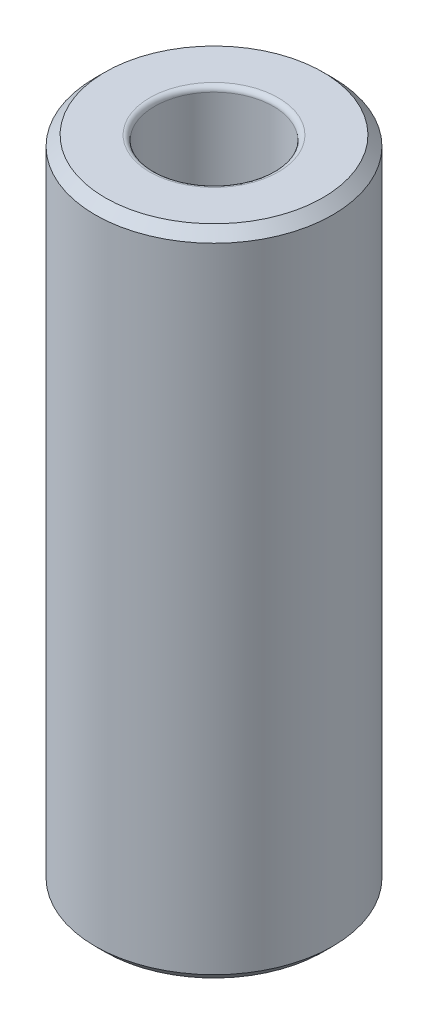
ISO-10303-21;
HEADER;
FILE_DESCRIPTION(('STEP AP214'),'2;1');
FILE_NAME('part.step','',(''),(''),'','','');
FILE_SCHEMA(('AUTOMOTIVE_DESIGN { 1 0 10303 214 1 1 1 1 }'));
ENDSEC;
DATA;
#1=APPLICATION_CONTEXT('core data for automotive mechanical design processes');
#2=APPLICATION_PROTOCOL_DEFINITION('international standard','automotive_design',2000,#1);
#3=PRODUCT_CONTEXT('',#1,'mechanical');
#4=PRODUCT('Part','Part','',(#3));
#5=PRODUCT_RELATED_PRODUCT_CATEGORY('part','',(#4));
#6=PRODUCT_DEFINITION_FORMATION('','',#4);
#7=PRODUCT_DEFINITION_CONTEXT('part definition',#1,'design');
#8=PRODUCT_DEFINITION('design','',#6,#7);
#9=PRODUCT_DEFINITION_SHAPE('','',#8);
#10=(LENGTH_UNIT() NAMED_UNIT(*) SI_UNIT(.MILLI.,.METRE.));
#11=(NAMED_UNIT(*) PLANE_ANGLE_UNIT() SI_UNIT($,.RADIAN.));
#12=(NAMED_UNIT(*) SI_UNIT($,.STERADIAN.) SOLID_ANGLE_UNIT());
#13=UNCERTAINTY_MEASURE_WITH_UNIT(LENGTH_MEASURE(1.E-05),#10,'distance_accuracy_value','');
#14=(GEOMETRIC_REPRESENTATION_CONTEXT(3) GLOBAL_UNCERTAINTY_ASSIGNED_CONTEXT((#13)) GLOBAL_UNIT_ASSIGNED_CONTEXT((#10,
#11,#12)) REPRESENTATION_CONTEXT('',''));
#15=CARTESIAN_POINT('',(0.,0.,0.));
#16=DIRECTION('',(0.,0.,1.));
#17=DIRECTION('',(1.,0.,0.));
#18=AXIS2_PLACEMENT_3D('',#15,#16,#17);
#19=CARTESIAN_POINT('',(0.,16.5,0.));
#20=DIRECTION('',(0.,-1.,0.));
#21=DIRECTION('',(0.,0.,-1.));
#22=AXIS2_PLACEMENT_3D('',#19,#20,#21);
#23=CYLINDRICAL_SURFACE('',#22,1.5);
#24=CARTESIAN_POINT('',(0.,0.125,0.));
#25=DIRECTION('',(0.,1.,0.));
#26=DIRECTION('',(0.,0.,1.));
#27=AXIS2_PLACEMENT_3D('',#24,#25,#26);
#28=CIRCLE('',#27,1.5);
#29=CARTESIAN_POINT('',(0.,0.125,1.5));
#30=VERTEX_POINT('',#29);
#31=EDGE_CURVE('E55',#30,#30,#28,.F.);
#32=ORIENTED_EDGE('',*,*,#31,.T.);
#33=EDGE_LOOP('',(#32));
#34=FACE_BOUND('',#33,.T.);
#35=CARTESIAN_POINT('',(0.,16.375,0.));
#36=DIRECTION('',(0.,1.,0.));
#37=DIRECTION('',(0.,0.,1.));
#38=AXIS2_PLACEMENT_3D('',#35,#36,#37);
#39=CIRCLE('',#38,1.5);
#40=CARTESIAN_POINT('',(0.,16.375,1.5));
#41=VERTEX_POINT('',#40);
#42=EDGE_CURVE('E60',#41,#41,#39,.T.);
#43=ORIENTED_EDGE('',*,*,#42,.T.);
#44=EDGE_LOOP('',(#43));
#45=FACE_BOUND('',#44,.T.);
#46=ADVANCED_FACE('F47',(#34,#45),#23,.F.);
#47=CARTESIAN_POINT('',(0.,16.5,0.));
#48=DIRECTION('',(0.,-1.,0.));
#49=DIRECTION('',(0.,0.,-1.));
#50=AXIS2_PLACEMENT_3D('',#47,#48,#49);
#51=CYLINDRICAL_SURFACE('',#50,3.);
#52=CARTESIAN_POINT('',(0.,0.25,0.));
#53=DIRECTION('',(0.,1.,0.));
#54=DIRECTION('',(0.,0.,1.));
#55=AXIS2_PLACEMENT_3D('',#52,#53,#54);
#56=CIRCLE('',#55,3.);
#57=CARTESIAN_POINT('',(0.,0.25,3.));
#58=VERTEX_POINT('',#57);
#59=EDGE_CURVE('E79',#58,#58,#56,.T.);
#60=ORIENTED_EDGE('',*,*,#59,.T.);
#61=EDGE_LOOP('',(#60));
#62=FACE_BOUND('',#61,.T.);
#63=CARTESIAN_POINT('',(0.,16.25,0.));
#64=DIRECTION('',(0.,1.,0.));
#65=DIRECTION('',(0.,0.,1.));
#66=AXIS2_PLACEMENT_3D('',#63,#64,#65);
#67=CIRCLE('',#66,3.);
#68=CARTESIAN_POINT('',(0.,16.25,3.));
#69=VERTEX_POINT('',#68);
#70=EDGE_CURVE('E83',#69,#69,#67,.F.);
#71=ORIENTED_EDGE('',*,*,#70,.T.);
#72=EDGE_LOOP('',(#71));
#73=FACE_BOUND('',#72,.T.);
#74=ADVANCED_FACE('F88',(#62,#73),#51,.T.);
#75=CARTESIAN_POINT('',(0.,16.5,0.));
#76=DIRECTION('',(0.,1.,0.));
#77=DIRECTION('',(0.,0.,1.));
#78=AXIS2_PLACEMENT_3D('',#75,#76,#77);
#79=PLANE('',#78);
#80=CARTESIAN_POINT('',(0.,16.5,0.));
#81=DIRECTION('',(0.,1.,0.));
#82=DIRECTION('',(0.,0.,1.));
#83=AXIS2_PLACEMENT_3D('',#80,#81,#82);
#84=CIRCLE('',#83,1.625);
#85=CARTESIAN_POINT('',(0.,16.5,1.625));
#86=VERTEX_POINT('',#85);
#87=EDGE_CURVE('E10',#86,#86,#84,.F.);
#88=ORIENTED_EDGE('',*,*,#87,.T.);
#89=EDGE_LOOP('',(#88));
#90=FACE_BOUND('',#89,.T.);
#91=CARTESIAN_POINT('',(0.,16.5,0.));
#92=DIRECTION('',(0.,1.,0.));
#93=DIRECTION('',(0.,0.,1.));
#94=AXIS2_PLACEMENT_3D('',#91,#92,#93);
#95=CIRCLE('',#94,2.75);
#96=CARTESIAN_POINT('',(0.,16.5,2.75));
#97=VERTEX_POINT('',#96);
#98=EDGE_CURVE('E71',#97,#97,#95,.T.);
#99=ORIENTED_EDGE('',*,*,#98,.T.);
#100=EDGE_LOOP('',(#99));
#101=FACE_BOUND('',#100,.T.);
#102=ADVANCED_FACE('F98',(#90,#101),#79,.T.);
#103=CARTESIAN_POINT('',(0.,0.,0.));
#104=DIRECTION('',(0.,1.,0.));
#105=DIRECTION('',(0.,0.,1.));
#106=AXIS2_PLACEMENT_3D('',#103,#104,#105);
#107=PLANE('',#106);
#108=CARTESIAN_POINT('',(0.,0.,0.));
#109=DIRECTION('',(0.,1.,0.));
#110=DIRECTION('',(0.,0.,1.));
#111=AXIS2_PLACEMENT_3D('',#108,#109,#110);
#112=CIRCLE('',#111,1.625);
#113=CARTESIAN_POINT('',(0.,0.,1.625));
#114=VERTEX_POINT('',#113);
#115=EDGE_CURVE('E65',#114,#114,#112,.T.);
#116=ORIENTED_EDGE('',*,*,#115,.T.);
#117=EDGE_LOOP('',(#116));
#118=FACE_BOUND('',#117,.T.);
#119=CARTESIAN_POINT('',(0.,0.,0.));
#120=DIRECTION('',(0.,1.,0.));
#121=DIRECTION('',(0.,0.,1.));
#122=AXIS2_PLACEMENT_3D('',#119,#120,#121);
#123=CIRCLE('',#122,2.75);
#124=CARTESIAN_POINT('',(0.,0.,2.75));
#125=VERTEX_POINT('',#124);
#126=EDGE_CURVE('E75',#125,#125,#123,.F.);
#127=ORIENTED_EDGE('',*,*,#126,.T.);
#128=EDGE_LOOP('',(#127));
#129=FACE_BOUND('',#128,.T.);
#130=ADVANCED_FACE('F100',(#118,#129),#107,.F.);
#131=CARTESIAN_POINT('',(0.,0.25,0.));
#132=DIRECTION('',(0.,1.,0.));
#133=DIRECTION('',(0.,0.,1.));
#134=AXIS2_PLACEMENT_3D('',#131,#132,#133);
#135=CONICAL_SURFACE('',#134,3.,0.785398163397454);
#136=ORIENTED_EDGE('',*,*,#126,.F.);
#137=EDGE_LOOP('',(#136));
#138=FACE_BOUND('',#137,.T.);
#139=ORIENTED_EDGE('',*,*,#59,.F.);
#140=EDGE_LOOP('',(#139));
#141=FACE_BOUND('',#140,.T.);
#142=ADVANCED_FACE('F94',(#138,#141),#135,.T.);
#143=CARTESIAN_POINT('',(0.,16.5,0.));
#144=DIRECTION('',(0.,-1.,0.));
#145=DIRECTION('',(0.,0.,-1.));
#146=AXIS2_PLACEMENT_3D('',#143,#144,#145);
#147=CONICAL_SURFACE('',#146,2.75,0.785398163397454);
#148=ORIENTED_EDGE('',*,*,#70,.F.);
#149=EDGE_LOOP('',(#148));
#150=FACE_BOUND('',#149,.T.);
#151=ORIENTED_EDGE('',*,*,#98,.F.);
#152=EDGE_LOOP('',(#151));
#153=FACE_BOUND('',#152,.T.);
#154=ADVANCED_FACE('F90',(#150,#153),#147,.T.);
#155=CARTESIAN_POINT('',(0.,0.125,0.));
#156=DIRECTION('',(0.,1.,0.));
#157=DIRECTION('',(0.,0.,1.));
#158=AXIS2_PLACEMENT_3D('',#155,#156,#157);
#159=TOROIDAL_SURFACE('',#158,1.625,0.125);
#160=ORIENTED_EDGE('',*,*,#31,.F.);
#161=EDGE_LOOP('',(#160));
#162=FACE_BOUND('',#161,.T.);
#163=ORIENTED_EDGE('',*,*,#115,.F.);
#164=EDGE_LOOP('',(#163));
#165=FACE_BOUND('',#164,.T.);
#166=ADVANCED_FACE('F93',(#162,#165),#159,.T.);
#167=CARTESIAN_POINT('',(0.,16.375,0.));
#168=DIRECTION('',(0.,1.,0.));
#169=DIRECTION('',(0.,0.,1.));
#170=AXIS2_PLACEMENT_3D('',#167,#168,#169);
#171=TOROIDAL_SURFACE('',#170,1.625,0.125);
#172=ORIENTED_EDGE('',*,*,#87,.F.);
#173=EDGE_LOOP('',(#172));
#174=FACE_BOUND('',#173,.T.);
#175=ORIENTED_EDGE('',*,*,#42,.F.);
#176=EDGE_LOOP('',(#175));
#177=FACE_BOUND('',#176,.T.);
#178=ADVANCED_FACE('F49',(#174,#177),#171,.T.);
#179=CLOSED_SHELL('',(#46,#74,#102,#130,#142,#154,#166,#178));
#180=MANIFOLD_SOLID_BREP('B2',#179);
#181=ADVANCED_BREP_SHAPE_REPRESENTATION('',(#18,#180),#14);
#182=SHAPE_DEFINITION_REPRESENTATION(#9,#181);
ENDSEC;
END-ISO-10303-21;
